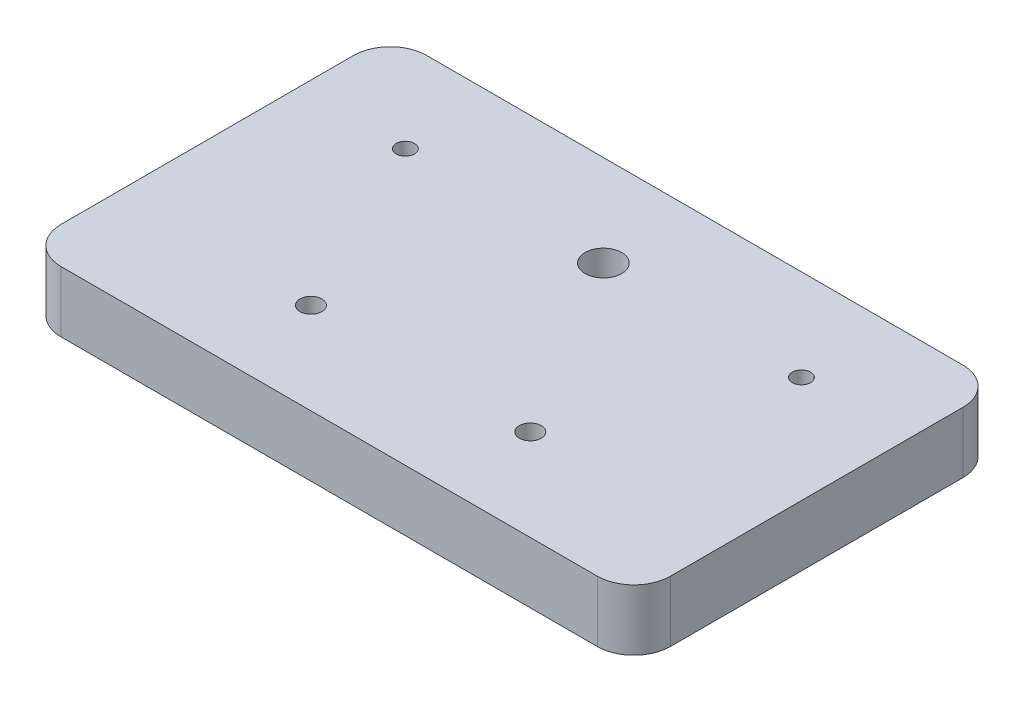
ISO-10303-21;
HEADER;
FILE_DESCRIPTION(('STEP AP214'),'2;1');
FILE_NAME('part.step','',(''),(''),'','','');
FILE_SCHEMA(('AUTOMOTIVE_DESIGN { 1 0 10303 214 1 1 1 1 }'));
ENDSEC;
DATA;
#1=APPLICATION_CONTEXT('core data for automotive mechanical design processes');
#2=APPLICATION_PROTOCOL_DEFINITION('international standard','automotive_design',2000,#1);
#3=PRODUCT_CONTEXT('',#1,'mechanical');
#4=PRODUCT('Part','Part','',(#3));
#5=PRODUCT_RELATED_PRODUCT_CATEGORY('part','',(#4));
#6=PRODUCT_DEFINITION_FORMATION('','',#4);
#7=PRODUCT_DEFINITION_CONTEXT('part definition',#1,'design');
#8=PRODUCT_DEFINITION('design','',#6,#7);
#9=PRODUCT_DEFINITION_SHAPE('','',#8);
#10=(LENGTH_UNIT() NAMED_UNIT(*) SI_UNIT(.MILLI.,.METRE.));
#11=(NAMED_UNIT(*) PLANE_ANGLE_UNIT() SI_UNIT($,.RADIAN.));
#12=(NAMED_UNIT(*) SI_UNIT($,.STERADIAN.) SOLID_ANGLE_UNIT());
#13=UNCERTAINTY_MEASURE_WITH_UNIT(LENGTH_MEASURE(1.E-05),#10,'distance_accuracy_value','');
#14=(GEOMETRIC_REPRESENTATION_CONTEXT(3) GLOBAL_UNCERTAINTY_ASSIGNED_CONTEXT((#13)) GLOBAL_UNIT_ASSIGNED_CONTEXT((#10,
#11,#12)) REPRESENTATION_CONTEXT('',''));
#15=CARTESIAN_POINT('',(0.,0.,0.));
#16=DIRECTION('',(0.,0.,1.));
#17=DIRECTION('',(1.,0.,0.));
#18=AXIS2_PLACEMENT_3D('',#15,#16,#17);
#19=CARTESIAN_POINT('',(50.,10.,30.));
#20=DIRECTION('',(-1.,0.,0.));
#21=DIRECTION('',(0.,0.,1.));
#22=AXIS2_PLACEMENT_3D('',#19,#20,#21);
#23=PLANE('',#22);
#24=DIRECTION('',(0.,0.,-1.));
#25=VECTOR('',#24,1.);
#26=CARTESIAN_POINT('',(50.,10.,30.));
#27=LINE('',#26,#25);
#28=CARTESIAN_POINT('',(50.,10.,24.));
#29=VERTEX_POINT('',#28);
#30=CARTESIAN_POINT('',(50.,10.,-24.));
#31=VERTEX_POINT('',#30);
#32=EDGE_CURVE('E135',#29,#31,#27,.T.);
#33=ORIENTED_EDGE('',*,*,#32,.F.);
#34=DIRECTION('',(0.,-1.,0.));
#35=VECTOR('',#34,1.);
#36=CARTESIAN_POINT('',(50.,10.,24.));
#37=LINE('',#36,#35);
#38=CARTESIAN_POINT('',(50.,0.,24.));
#39=VERTEX_POINT('',#38);
#40=EDGE_CURVE('E174',#29,#39,#37,.T.);
#41=ORIENTED_EDGE('',*,*,#40,.T.);
#42=DIRECTION('',(0.,0.,-1.));
#43=VECTOR('',#42,1.);
#44=CARTESIAN_POINT('',(50.,0.,30.));
#45=LINE('',#44,#43);
#46=CARTESIAN_POINT('',(50.,0.,-24.));
#47=VERTEX_POINT('',#46);
#48=EDGE_CURVE('E189',#39,#47,#45,.T.);
#49=ORIENTED_EDGE('',*,*,#48,.T.);
#50=DIRECTION('',(0.,-1.,0.));
#51=VECTOR('',#50,1.);
#52=CARTESIAN_POINT('',(50.,10.,-24.));
#53=LINE('',#52,#51);
#54=EDGE_CURVE('E171',#47,#31,#53,.F.);
#55=ORIENTED_EDGE('',*,*,#54,.T.);
#56=EDGE_LOOP('',(#33,#41,#49,#55));
#57=FACE_BOUND('',#56,.T.);
#58=ADVANCED_FACE('F39',(#57),#23,.F.);
#59=CARTESIAN_POINT('',(-50.,10.,-30.));
#60=DIRECTION('',(0.,0.,1.));
#61=DIRECTION('',(1.,0.,0.));
#62=AXIS2_PLACEMENT_3D('',#59,#60,#61);
#63=PLANE('',#62);
#64=DIRECTION('',(-1.,0.,0.));
#65=VECTOR('',#64,1.);
#66=CARTESIAN_POINT('',(-50.,10.,-30.));
#67=LINE('',#66,#65);
#68=CARTESIAN_POINT('',(44.,10.,-30.));
#69=VERTEX_POINT('',#68);
#70=CARTESIAN_POINT('',(-44.,10.,-30.));
#71=VERTEX_POINT('',#70);
#72=EDGE_CURVE('E140',#69,#71,#67,.T.);
#73=ORIENTED_EDGE('',*,*,#72,.F.);
#74=DIRECTION('',(0.,-1.,0.));
#75=VECTOR('',#74,1.);
#76=CARTESIAN_POINT('',(44.,10.,-30.));
#77=LINE('',#76,#75);
#78=CARTESIAN_POINT('',(44.,0.,-30.));
#79=VERTEX_POINT('',#78);
#80=EDGE_CURVE('E11',#69,#79,#77,.T.);
#81=ORIENTED_EDGE('',*,*,#80,.T.);
#82=DIRECTION('',(-1.,0.,0.));
#83=VECTOR('',#82,1.);
#84=CARTESIAN_POINT('',(-50.,0.,-30.));
#85=LINE('',#84,#83);
#86=CARTESIAN_POINT('',(-44.,0.,-30.));
#87=VERTEX_POINT('',#86);
#88=EDGE_CURVE('E142',#79,#87,#85,.T.);
#89=ORIENTED_EDGE('',*,*,#88,.T.);
#90=DIRECTION('',(0.,-1.,0.));
#91=VECTOR('',#90,1.);
#92=CARTESIAN_POINT('',(-44.,10.,-30.));
#93=LINE('',#92,#91);
#94=EDGE_CURVE('E48',#87,#71,#93,.F.);
#95=ORIENTED_EDGE('',*,*,#94,.T.);
#96=EDGE_LOOP('',(#73,#81,#89,#95));
#97=FACE_BOUND('',#96,.T.);
#98=ADVANCED_FACE('F195',(#97),#63,.F.);
#99=CARTESIAN_POINT('',(-50.,10.,30.));
#100=DIRECTION('',(1.,0.,0.));
#101=DIRECTION('',(0.,0.,-1.));
#102=AXIS2_PLACEMENT_3D('',#99,#100,#101);
#103=PLANE('',#102);
#104=DIRECTION('',(0.,0.,1.));
#105=VECTOR('',#104,1.);
#106=CARTESIAN_POINT('',(-50.,0.,30.));
#107=LINE('',#106,#105);
#108=CARTESIAN_POINT('',(-50.,0.,-24.));
#109=VERTEX_POINT('',#108);
#110=CARTESIAN_POINT('',(-50.,0.,24.));
#111=VERTEX_POINT('',#110);
#112=EDGE_CURVE('E136',#109,#111,#107,.T.);
#113=ORIENTED_EDGE('',*,*,#112,.T.);
#114=DIRECTION('',(0.,-1.,0.));
#115=VECTOR('',#114,1.);
#116=CARTESIAN_POINT('',(-50.,10.,24.));
#117=LINE('',#116,#115);
#118=CARTESIAN_POINT('',(-50.,10.,24.));
#119=VERTEX_POINT('',#118);
#120=EDGE_CURVE('E111',#111,#119,#117,.F.);
#121=ORIENTED_EDGE('',*,*,#120,.T.);
#122=DIRECTION('',(0.,0.,1.));
#123=VECTOR('',#122,1.);
#124=CARTESIAN_POINT('',(-50.,10.,30.));
#125=LINE('',#124,#123);
#126=CARTESIAN_POINT('',(-50.,10.,-24.));
#127=VERTEX_POINT('',#126);
#128=EDGE_CURVE('E180',#127,#119,#125,.T.);
#129=ORIENTED_EDGE('',*,*,#128,.F.);
#130=DIRECTION('',(0.,-1.,0.));
#131=VECTOR('',#130,1.);
#132=CARTESIAN_POINT('',(-50.,10.,-24.));
#133=LINE('',#132,#131);
#134=EDGE_CURVE('E117',#127,#109,#133,.T.);
#135=ORIENTED_EDGE('',*,*,#134,.T.);
#136=EDGE_LOOP('',(#113,#121,#129,#135));
#137=FACE_BOUND('',#136,.T.);
#138=ADVANCED_FACE('F202',(#137),#103,.F.);
#139=CARTESIAN_POINT('',(-50.,10.,30.));
#140=DIRECTION('',(0.,0.,-1.));
#141=DIRECTION('',(-1.,0.,0.));
#142=AXIS2_PLACEMENT_3D('',#139,#140,#141);
#143=PLANE('',#142);
#144=DIRECTION('',(1.,0.,0.));
#145=VECTOR('',#144,1.);
#146=CARTESIAN_POINT('',(-50.,10.,30.));
#147=LINE('',#146,#145);
#148=CARTESIAN_POINT('',(-44.,10.,30.));
#149=VERTEX_POINT('',#148);
#150=CARTESIAN_POINT('',(44.,10.,30.));
#151=VERTEX_POINT('',#150);
#152=EDGE_CURVE('E127',#149,#151,#147,.T.);
#153=ORIENTED_EDGE('',*,*,#152,.F.);
#154=DIRECTION('',(0.,-1.,0.));
#155=VECTOR('',#154,1.);
#156=CARTESIAN_POINT('',(-44.,10.,30.));
#157=LINE('',#156,#155);
#158=CARTESIAN_POINT('',(-44.,0.,30.));
#159=VERTEX_POINT('',#158);
#160=EDGE_CURVE('E110',#149,#159,#157,.T.);
#161=ORIENTED_EDGE('',*,*,#160,.T.);
#162=DIRECTION('',(1.,0.,0.));
#163=VECTOR('',#162,1.);
#164=CARTESIAN_POINT('',(-50.,0.,30.));
#165=LINE('',#164,#163);
#166=CARTESIAN_POINT('',(44.,0.,30.));
#167=VERTEX_POINT('',#166);
#168=EDGE_CURVE('E124',#159,#167,#165,.T.);
#169=ORIENTED_EDGE('',*,*,#168,.T.);
#170=DIRECTION('',(0.,-1.,0.));
#171=VECTOR('',#170,1.);
#172=CARTESIAN_POINT('',(44.,10.,30.));
#173=LINE('',#172,#171);
#174=EDGE_CURVE('E130',#167,#151,#173,.F.);
#175=ORIENTED_EDGE('',*,*,#174,.T.);
#176=EDGE_LOOP('',(#153,#161,#169,#175));
#177=FACE_BOUND('',#176,.T.);
#178=ADVANCED_FACE('F123',(#177),#143,.F.);
#179=CARTESIAN_POINT('',(0.,10.,0.));
#180=DIRECTION('',(0.,-1.,0.));
#181=DIRECTION('',(0.,0.,-1.));
#182=AXIS2_PLACEMENT_3D('',#179,#180,#181);
#183=PLANE('',#182);
#184=CARTESIAN_POINT('',(32.5,10.,-15.));
#185=DIRECTION('',(0.,-1.,0.));
#186=DIRECTION('',(0.,0.,-1.));
#187=AXIS2_PLACEMENT_3D('',#184,#185,#186);
#188=CIRCLE('',#187,1.5);
#189=CARTESIAN_POINT('',(32.5,10.,-16.5));
#190=VERTEX_POINT('',#189);
#191=EDGE_CURVE('E425',#190,#190,#188,.F.);
#192=ORIENTED_EDGE('',*,*,#191,.F.);
#193=EDGE_LOOP('',(#192));
#194=FACE_BOUND('',#193,.T.);
#195=CARTESIAN_POINT('',(-32.5,10.,-15.));
#196=DIRECTION('',(0.,-1.,0.));
#197=DIRECTION('',(0.,0.,-1.));
#198=AXIS2_PLACEMENT_3D('',#195,#196,#197);
#199=CIRCLE('',#198,1.5);
#200=CARTESIAN_POINT('',(-32.5,10.,-16.5));
#201=VERTEX_POINT('',#200);
#202=EDGE_CURVE('E424',#201,#201,#199,.F.);
#203=ORIENTED_EDGE('',*,*,#202,.F.);
#204=EDGE_LOOP('',(#203));
#205=FACE_BOUND('',#204,.T.);
#206=CARTESIAN_POINT('',(0.,10.,-15.));
#207=DIRECTION('',(0.,-1.,0.));
#208=DIRECTION('',(0.,0.,-1.));
#209=AXIS2_PLACEMENT_3D('',#206,#207,#208);
#210=CIRCLE('',#209,3.);
#211=CARTESIAN_POINT('',(0.,10.,-18.));
#212=VERTEX_POINT('',#211);
#213=EDGE_CURVE('E416',#212,#212,#210,.F.);
#214=ORIENTED_EDGE('',*,*,#213,.F.);
#215=EDGE_LOOP('',(#214));
#216=FACE_BOUND('',#215,.T.);
#217=CARTESIAN_POINT('',(18.,10.,15.));
#218=DIRECTION('',(0.,-1.,0.));
#219=DIRECTION('',(0.,0.,-1.));
#220=AXIS2_PLACEMENT_3D('',#217,#218,#219);
#221=CIRCLE('',#220,1.8);
#222=CARTESIAN_POINT('',(18.,10.,13.2));
#223=VERTEX_POINT('',#222);
#224=EDGE_CURVE('E400',#223,#223,#221,.T.);
#225=ORIENTED_EDGE('',*,*,#224,.T.);
#226=EDGE_LOOP('',(#225));
#227=FACE_BOUND('',#226,.T.);
#228=CARTESIAN_POINT('',(-18.,10.,15.));
#229=DIRECTION('',(0.,-1.,0.));
#230=DIRECTION('',(0.,0.,-1.));
#231=AXIS2_PLACEMENT_3D('',#228,#229,#230);
#232=CIRCLE('',#231,1.8);
#233=CARTESIAN_POINT('',(-18.,10.,13.2));
#234=VERTEX_POINT('',#233);
#235=EDGE_CURVE('E192',#234,#234,#232,.T.);
#236=ORIENTED_EDGE('',*,*,#235,.T.);
#237=EDGE_LOOP('',(#236));
#238=FACE_BOUND('',#237,.T.);
#239=ORIENTED_EDGE('',*,*,#128,.T.);
#240=CARTESIAN_POINT('',(-44.,10.,24.));
#241=DIRECTION('',(0.,-1.,0.));
#242=DIRECTION('',(0.,0.,-1.));
#243=AXIS2_PLACEMENT_3D('',#240,#241,#242);
#244=CIRCLE('',#243,6.);
#245=EDGE_CURVE('E168',#119,#149,#244,.F.);
#246=ORIENTED_EDGE('',*,*,#245,.T.);
#247=ORIENTED_EDGE('',*,*,#152,.T.);
#248=CARTESIAN_POINT('',(44.,10.,24.));
#249=DIRECTION('',(0.,-1.,0.));
#250=DIRECTION('',(0.,0.,-1.));
#251=AXIS2_PLACEMENT_3D('',#248,#249,#250);
#252=CIRCLE('',#251,6.);
#253=EDGE_CURVE('E165',#151,#29,#252,.F.);
#254=ORIENTED_EDGE('',*,*,#253,.T.);
#255=ORIENTED_EDGE('',*,*,#32,.T.);
#256=CARTESIAN_POINT('',(44.,10.,-24.));
#257=DIRECTION('',(0.,-1.,0.));
#258=DIRECTION('',(0.,0.,-1.));
#259=AXIS2_PLACEMENT_3D('',#256,#257,#258);
#260=CIRCLE('',#259,6.);
#261=EDGE_CURVE('E61',#31,#69,#260,.F.);
#262=ORIENTED_EDGE('',*,*,#261,.T.);
#263=ORIENTED_EDGE('',*,*,#72,.T.);
#264=CARTESIAN_POINT('',(-44.,10.,-24.));
#265=DIRECTION('',(0.,-1.,0.));
#266=DIRECTION('',(0.,0.,-1.));
#267=AXIS2_PLACEMENT_3D('',#264,#265,#266);
#268=CIRCLE('',#267,6.);
#269=EDGE_CURVE('E160',#71,#127,#268,.F.);
#270=ORIENTED_EDGE('',*,*,#269,.T.);
#271=EDGE_LOOP('',(#239,#246,#247,#254,#255,#262,#263,#270));
#272=FACE_BOUND('',#271,.T.);
#273=ADVANCED_FACE('F200',(#194,#205,#216,#227,#238,#272),#183,.F.);
#274=CARTESIAN_POINT('',(0.,0.,0.));
#275=DIRECTION('',(0.,-1.,0.));
#276=DIRECTION('',(0.,0.,-1.));
#277=AXIS2_PLACEMENT_3D('',#274,#275,#276);
#278=PLANE('',#277);
#279=CARTESIAN_POINT('',(32.5,0.,-15.));
#280=DIRECTION('',(0.,-1.,0.));
#281=DIRECTION('',(0.,0.,-1.));
#282=AXIS2_PLACEMENT_3D('',#279,#280,#281);
#283=CIRCLE('',#282,1.5);
#284=CARTESIAN_POINT('',(32.5,0.,-16.5));
#285=VERTEX_POINT('',#284);
#286=EDGE_CURVE('E430',#285,#285,#283,.T.);
#287=ORIENTED_EDGE('',*,*,#286,.F.);
#288=EDGE_LOOP('',(#287));
#289=FACE_BOUND('',#288,.T.);
#290=CARTESIAN_POINT('',(-32.5,0.,-15.));
#291=DIRECTION('',(0.,-1.,0.));
#292=DIRECTION('',(0.,0.,-1.));
#293=AXIS2_PLACEMENT_3D('',#290,#291,#292);
#294=CIRCLE('',#293,1.5);
#295=CARTESIAN_POINT('',(-32.5,0.,-16.5));
#296=VERTEX_POINT('',#295);
#297=EDGE_CURVE('E429',#296,#296,#294,.T.);
#298=ORIENTED_EDGE('',*,*,#297,.F.);
#299=EDGE_LOOP('',(#298));
#300=FACE_BOUND('',#299,.T.);
#301=CARTESIAN_POINT('',(0.,0.,-15.));
#302=DIRECTION('',(0.,-1.,0.));
#303=DIRECTION('',(0.,0.,-1.));
#304=AXIS2_PLACEMENT_3D('',#301,#302,#303);
#305=CIRCLE('',#304,3.);
#306=CARTESIAN_POINT('',(0.,0.,-18.));
#307=VERTEX_POINT('',#306);
#308=EDGE_CURVE('E420',#307,#307,#305,.T.);
#309=ORIENTED_EDGE('',*,*,#308,.F.);
#310=EDGE_LOOP('',(#309));
#311=FACE_BOUND('',#310,.T.);
#312=CARTESIAN_POINT('',(18.,0.,15.));
#313=DIRECTION('',(0.,-1.,0.));
#314=DIRECTION('',(0.,0.,-1.));
#315=AXIS2_PLACEMENT_3D('',#312,#313,#314);
#316=CIRCLE('',#315,3.25);
#317=CARTESIAN_POINT('',(18.,0.,11.75));
#318=VERTEX_POINT('',#317);
#319=EDGE_CURVE('E412',#318,#318,#316,.T.);
#320=ORIENTED_EDGE('',*,*,#319,.F.);
#321=EDGE_LOOP('',(#320));
#322=FACE_BOUND('',#321,.T.);
#323=CARTESIAN_POINT('',(-18.,0.,15.));
#324=DIRECTION('',(0.,-1.,0.));
#325=DIRECTION('',(0.,0.,-1.));
#326=AXIS2_PLACEMENT_3D('',#323,#324,#325);
#327=CIRCLE('',#326,3.25);
#328=CARTESIAN_POINT('',(-18.,0.,11.75));
#329=VERTEX_POINT('',#328);
#330=EDGE_CURVE('E394',#329,#329,#327,.T.);
#331=ORIENTED_EDGE('',*,*,#330,.F.);
#332=EDGE_LOOP('',(#331));
#333=FACE_BOUND('',#332,.T.);
#334=ORIENTED_EDGE('',*,*,#168,.F.);
#335=CARTESIAN_POINT('',(-44.,0.,24.));
#336=DIRECTION('',(0.,-1.,0.));
#337=DIRECTION('',(0.,0.,-1.));
#338=AXIS2_PLACEMENT_3D('',#335,#336,#337);
#339=CIRCLE('',#338,6.);
#340=EDGE_CURVE('E106',#159,#111,#339,.T.);
#341=ORIENTED_EDGE('',*,*,#340,.T.);
#342=ORIENTED_EDGE('',*,*,#112,.F.);
#343=CARTESIAN_POINT('',(-44.,0.,-24.));
#344=DIRECTION('',(0.,-1.,0.));
#345=DIRECTION('',(0.,0.,-1.));
#346=AXIS2_PLACEMENT_3D('',#343,#344,#345);
#347=CIRCLE('',#346,6.);
#348=EDGE_CURVE('E129',#109,#87,#347,.T.);
#349=ORIENTED_EDGE('',*,*,#348,.T.);
#350=ORIENTED_EDGE('',*,*,#88,.F.);
#351=CARTESIAN_POINT('',(44.,0.,-24.));
#352=DIRECTION('',(0.,-1.,0.));
#353=DIRECTION('',(0.,0.,-1.));
#354=AXIS2_PLACEMENT_3D('',#351,#352,#353);
#355=CIRCLE('',#354,6.);
#356=EDGE_CURVE('E150',#79,#47,#355,.T.);
#357=ORIENTED_EDGE('',*,*,#356,.T.);
#358=ORIENTED_EDGE('',*,*,#48,.F.);
#359=CARTESIAN_POINT('',(44.,0.,24.));
#360=DIRECTION('',(0.,-1.,0.));
#361=DIRECTION('',(0.,0.,-1.));
#362=AXIS2_PLACEMENT_3D('',#359,#360,#361);
#363=CIRCLE('',#362,6.);
#364=EDGE_CURVE('E118',#39,#167,#363,.T.);
#365=ORIENTED_EDGE('',*,*,#364,.T.);
#366=EDGE_LOOP('',(#334,#341,#342,#349,#350,#357,#358,#365));
#367=FACE_BOUND('',#366,.T.);
#368=ADVANCED_FACE('F132',(#289,#300,#311,#322,#333,#367),#278,.T.);
#369=CARTESIAN_POINT('',(-18.,0.,15.));
#370=DIRECTION('',(0.,-1.,0.));
#371=DIRECTION('',(0.,0.,-1.));
#372=AXIS2_PLACEMENT_3D('',#369,#370,#371);
#373=CYLINDRICAL_SURFACE('',#372,1.8);
#374=ORIENTED_EDGE('',*,*,#235,.F.);
#375=EDGE_LOOP('',(#374));
#376=FACE_BOUND('',#375,.T.);
#377=CARTESIAN_POINT('',(-18.,3.,15.));
#378=DIRECTION('',(0.,-1.,0.));
#379=DIRECTION('',(0.,0.,-1.));
#380=AXIS2_PLACEMENT_3D('',#377,#378,#379);
#381=CIRCLE('',#380,1.8);
#382=CARTESIAN_POINT('',(-18.,3.,13.2));
#383=VERTEX_POINT('',#382);
#384=EDGE_CURVE('E387',#383,#383,#381,.T.);
#385=ORIENTED_EDGE('',*,*,#384,.T.);
#386=EDGE_LOOP('',(#385));
#387=FACE_BOUND('',#386,.T.);
#388=ADVANCED_FACE('F262',(#376,#387),#373,.F.);
#389=CARTESIAN_POINT('',(-16.2,3.,15.));
#390=DIRECTION('',(0.,1.,0.));
#391=DIRECTION('',(0.,0.,1.));
#392=AXIS2_PLACEMENT_3D('',#389,#390,#391);
#393=PLANE('',#392);
#394=ORIENTED_EDGE('',*,*,#384,.F.);
#395=EDGE_LOOP('',(#394));
#396=FACE_BOUND('',#395,.T.);
#397=CARTESIAN_POINT('',(-18.,3.,15.));
#398=DIRECTION('',(0.,-1.,0.));
#399=DIRECTION('',(0.,0.,-1.));
#400=AXIS2_PLACEMENT_3D('',#397,#398,#399);
#401=CIRCLE('',#400,3.25);
#402=CARTESIAN_POINT('',(-18.,3.,11.75));
#403=VERTEX_POINT('',#402);
#404=EDGE_CURVE('E389',#403,#403,#401,.T.);
#405=ORIENTED_EDGE('',*,*,#404,.T.);
#406=EDGE_LOOP('',(#405));
#407=FACE_BOUND('',#406,.T.);
#408=ADVANCED_FACE('F361',(#396,#407),#393,.F.);
#409=CARTESIAN_POINT('',(-18.,0.,15.));
#410=DIRECTION('',(0.,-1.,0.));
#411=DIRECTION('',(0.,0.,-1.));
#412=AXIS2_PLACEMENT_3D('',#409,#410,#411);
#413=CYLINDRICAL_SURFACE('',#412,3.25);
#414=ORIENTED_EDGE('',*,*,#404,.F.);
#415=EDGE_LOOP('',(#414));
#416=FACE_BOUND('',#415,.T.);
#417=ORIENTED_EDGE('',*,*,#330,.T.);
#418=EDGE_LOOP('',(#417));
#419=FACE_BOUND('',#418,.T.);
#420=ADVANCED_FACE('F351',(#416,#419),#413,.F.);
#421=CARTESIAN_POINT('',(18.,0.,15.));
#422=DIRECTION('',(0.,-1.,0.));
#423=DIRECTION('',(0.,0.,-1.));
#424=AXIS2_PLACEMENT_3D('',#421,#422,#423);
#425=CYLINDRICAL_SURFACE('',#424,1.8);
#426=ORIENTED_EDGE('',*,*,#224,.F.);
#427=EDGE_LOOP('',(#426));
#428=FACE_BOUND('',#427,.T.);
#429=CARTESIAN_POINT('',(18.,3.,15.));
#430=DIRECTION('',(0.,-1.,0.));
#431=DIRECTION('',(0.,0.,-1.));
#432=AXIS2_PLACEMENT_3D('',#429,#430,#431);
#433=CIRCLE('',#432,1.8);
#434=CARTESIAN_POINT('',(18.,3.,13.2));
#435=VERTEX_POINT('',#434);
#436=EDGE_CURVE('E404',#435,#435,#433,.T.);
#437=ORIENTED_EDGE('',*,*,#436,.T.);
#438=EDGE_LOOP('',(#437));
#439=FACE_BOUND('',#438,.T.);
#440=ADVANCED_FACE('F341',(#428,#439),#425,.F.);
#441=CARTESIAN_POINT('',(19.8,3.,15.));
#442=DIRECTION('',(0.,1.,0.));
#443=DIRECTION('',(0.,0.,1.));
#444=AXIS2_PLACEMENT_3D('',#441,#442,#443);
#445=PLANE('',#444);
#446=ORIENTED_EDGE('',*,*,#436,.F.);
#447=EDGE_LOOP('',(#446));
#448=FACE_BOUND('',#447,.T.);
#449=CARTESIAN_POINT('',(18.,3.,15.));
#450=DIRECTION('',(0.,-1.,0.));
#451=DIRECTION('',(0.,0.,-1.));
#452=AXIS2_PLACEMENT_3D('',#449,#450,#451);
#453=CIRCLE('',#452,3.25);
#454=CARTESIAN_POINT('',(18.,3.,11.75));
#455=VERTEX_POINT('',#454);
#456=EDGE_CURVE('E408',#455,#455,#453,.T.);
#457=ORIENTED_EDGE('',*,*,#456,.T.);
#458=EDGE_LOOP('',(#457));
#459=FACE_BOUND('',#458,.T.);
#460=ADVANCED_FACE('F331',(#448,#459),#445,.F.);
#461=CARTESIAN_POINT('',(18.,0.,15.));
#462=DIRECTION('',(0.,-1.,0.));
#463=DIRECTION('',(0.,0.,-1.));
#464=AXIS2_PLACEMENT_3D('',#461,#462,#463);
#465=CYLINDRICAL_SURFACE('',#464,3.25);
#466=ORIENTED_EDGE('',*,*,#456,.F.);
#467=EDGE_LOOP('',(#466));
#468=FACE_BOUND('',#467,.T.);
#469=ORIENTED_EDGE('',*,*,#319,.T.);
#470=EDGE_LOOP('',(#469));
#471=FACE_BOUND('',#470,.T.);
#472=ADVANCED_FACE('F321',(#468,#471),#465,.F.);
#473=CARTESIAN_POINT('',(0.,10.001,-15.));
#474=DIRECTION('',(0.,-1.,0.));
#475=DIRECTION('',(0.,0.,-1.));
#476=AXIS2_PLACEMENT_3D('',#473,#474,#475);
#477=CYLINDRICAL_SURFACE('',#476,3.);
#478=ORIENTED_EDGE('',*,*,#308,.T.);
#479=EDGE_LOOP('',(#478));
#480=FACE_BOUND('',#479,.T.);
#481=ORIENTED_EDGE('',*,*,#213,.T.);
#482=EDGE_LOOP('',(#481));
#483=FACE_BOUND('',#482,.T.);
#484=ADVANCED_FACE('F311',(#480,#483),#477,.F.);
#485=CARTESIAN_POINT('',(-32.5,10.001,-15.));
#486=DIRECTION('',(0.,-1.,0.));
#487=DIRECTION('',(0.,0.,-1.));
#488=AXIS2_PLACEMENT_3D('',#485,#486,#487);
#489=CYLINDRICAL_SURFACE('',#488,1.5);
#490=ORIENTED_EDGE('',*,*,#297,.T.);
#491=EDGE_LOOP('',(#490));
#492=FACE_BOUND('',#491,.T.);
#493=ORIENTED_EDGE('',*,*,#202,.T.);
#494=EDGE_LOOP('',(#493));
#495=FACE_BOUND('',#494,.T.);
#496=ADVANCED_FACE('F301',(#492,#495),#489,.F.);
#497=CARTESIAN_POINT('',(32.5,10.001,-15.));
#498=DIRECTION('',(0.,-1.,0.));
#499=DIRECTION('',(0.,0.,-1.));
#500=AXIS2_PLACEMENT_3D('',#497,#498,#499);
#501=CYLINDRICAL_SURFACE('',#500,1.5);
#502=ORIENTED_EDGE('',*,*,#286,.T.);
#503=EDGE_LOOP('',(#502));
#504=FACE_BOUND('',#503,.T.);
#505=ORIENTED_EDGE('',*,*,#191,.T.);
#506=EDGE_LOOP('',(#505));
#507=FACE_BOUND('',#506,.T.);
#508=ADVANCED_FACE('F221',(#504,#507),#501,.F.);
#509=CARTESIAN_POINT('',(-44.,10.,24.));
#510=DIRECTION('',(0.,-1.,0.));
#511=DIRECTION('',(0.,0.,-1.));
#512=AXIS2_PLACEMENT_3D('',#509,#510,#511);
#513=CYLINDRICAL_SURFACE('',#512,6.);
#514=ORIENTED_EDGE('',*,*,#245,.F.);
#515=ORIENTED_EDGE('',*,*,#120,.F.);
#516=ORIENTED_EDGE('',*,*,#340,.F.);
#517=ORIENTED_EDGE('',*,*,#160,.F.);
#518=EDGE_LOOP('',(#514,#515,#516,#517));
#519=FACE_BOUND('',#518,.T.);
#520=ADVANCED_FACE('F109',(#519),#513,.T.);
#521=CARTESIAN_POINT('',(44.,10.,24.));
#522=DIRECTION('',(0.,-1.,0.));
#523=DIRECTION('',(0.,0.,-1.));
#524=AXIS2_PLACEMENT_3D('',#521,#522,#523);
#525=CYLINDRICAL_SURFACE('',#524,6.);
#526=ORIENTED_EDGE('',*,*,#253,.F.);
#527=ORIENTED_EDGE('',*,*,#174,.F.);
#528=ORIENTED_EDGE('',*,*,#364,.F.);
#529=ORIENTED_EDGE('',*,*,#40,.F.);
#530=EDGE_LOOP('',(#526,#527,#528,#529));
#531=FACE_BOUND('',#530,.T.);
#532=ADVANCED_FACE('F220',(#531),#525,.T.);
#533=CARTESIAN_POINT('',(44.,10.,-24.));
#534=DIRECTION('',(0.,-1.,0.));
#535=DIRECTION('',(0.,0.,-1.));
#536=AXIS2_PLACEMENT_3D('',#533,#534,#535);
#537=CYLINDRICAL_SURFACE('',#536,6.);
#538=ORIENTED_EDGE('',*,*,#261,.F.);
#539=ORIENTED_EDGE('',*,*,#54,.F.);
#540=ORIENTED_EDGE('',*,*,#356,.F.);
#541=ORIENTED_EDGE('',*,*,#80,.F.);
#542=EDGE_LOOP('',(#538,#539,#540,#541));
#543=FACE_BOUND('',#542,.T.);
#544=ADVANCED_FACE('F223',(#543),#537,.T.);
#545=CARTESIAN_POINT('',(-44.,10.,-24.));
#546=DIRECTION('',(0.,-1.,0.));
#547=DIRECTION('',(0.,0.,-1.));
#548=AXIS2_PLACEMENT_3D('',#545,#546,#547);
#549=CYLINDRICAL_SURFACE('',#548,6.);
#550=ORIENTED_EDGE('',*,*,#269,.F.);
#551=ORIENTED_EDGE('',*,*,#94,.F.);
#552=ORIENTED_EDGE('',*,*,#348,.F.);
#553=ORIENTED_EDGE('',*,*,#134,.F.);
#554=EDGE_LOOP('',(#550,#551,#552,#553));
#555=FACE_BOUND('',#554,.T.);
#556=ADVANCED_FACE('F41',(#555),#549,.T.);
#557=CLOSED_SHELL('',(#58,#98,#138,#178,#273,#368,#388,#408,#420,#440,#460,#472,#484,#496,#508,
#520,#532,#544,#556));
#558=MANIFOLD_SOLID_BREP('B2',#557);
#559=ADVANCED_BREP_SHAPE_REPRESENTATION('',(#18,#558),#14);
#560=SHAPE_DEFINITION_REPRESENTATION(#9,#559);
ENDSEC;
END-ISO-10303-21;
